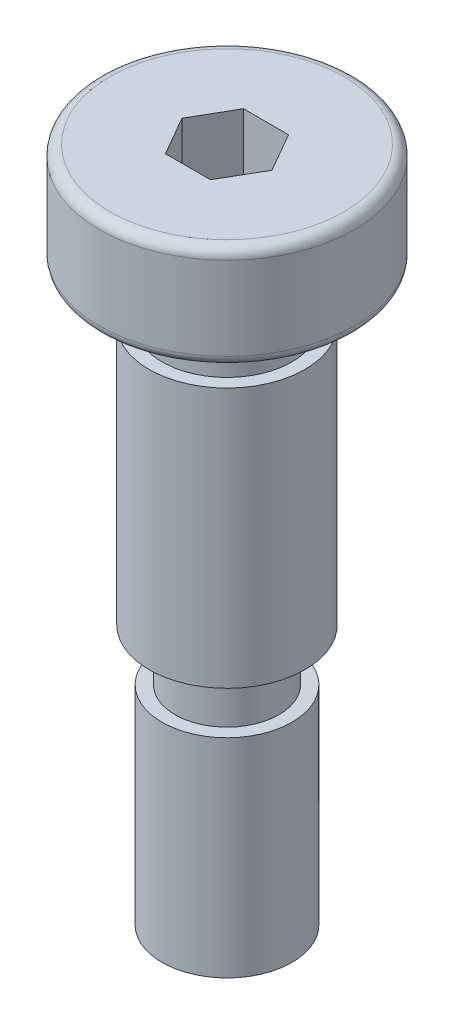
ISO-10303-21;
HEADER;
FILE_DESCRIPTION(('STEP AP214'),'2;1');
FILE_NAME('part.step','',(''),(''),'','','');
FILE_SCHEMA(('AUTOMOTIVE_DESIGN { 1 0 10303 214 1 1 1 1 }'));
ENDSEC;
DATA;
#1=APPLICATION_CONTEXT('core data for automotive mechanical design processes');
#2=APPLICATION_PROTOCOL_DEFINITION('international standard','automotive_design',2000,#1);
#3=PRODUCT_CONTEXT('',#1,'mechanical');
#4=PRODUCT('Part','Part','',(#3));
#5=PRODUCT_RELATED_PRODUCT_CATEGORY('part','',(#4));
#6=PRODUCT_DEFINITION_FORMATION('','',#4);
#7=PRODUCT_DEFINITION_CONTEXT('part definition',#1,'design');
#8=PRODUCT_DEFINITION('design','',#6,#7);
#9=PRODUCT_DEFINITION_SHAPE('','',#8);
#10=(LENGTH_UNIT() NAMED_UNIT(*) SI_UNIT(.MILLI.,.METRE.));
#11=(NAMED_UNIT(*) PLANE_ANGLE_UNIT() SI_UNIT($,.RADIAN.));
#12=(NAMED_UNIT(*) SI_UNIT($,.STERADIAN.) SOLID_ANGLE_UNIT());
#13=UNCERTAINTY_MEASURE_WITH_UNIT(LENGTH_MEASURE(1.E-05),#10,'distance_accuracy_value','');
#14=(GEOMETRIC_REPRESENTATION_CONTEXT(3) GLOBAL_UNCERTAINTY_ASSIGNED_CONTEXT((#13)) GLOBAL_UNIT_ASSIGNED_CONTEXT((#10,
#11,#12)) REPRESENTATION_CONTEXT('',''));
#15=CARTESIAN_POINT('',(0.,0.,0.));
#16=DIRECTION('',(0.,0.,1.));
#17=DIRECTION('',(1.,0.,0.));
#18=AXIS2_PLACEMENT_3D('',#15,#16,#17);
#19=CARTESIAN_POINT('',(0.,26.,0.));
#20=DIRECTION('',(0.,-1.,0.));
#21=DIRECTION('',(0.,0.,-1.));
#22=AXIS2_PLACEMENT_3D('',#19,#20,#21);
#23=PLANE('',#22);
#24=DIRECTION('',(-1.,0.,0.));
#25=VECTOR('',#24,1.);
#26=CARTESIAN_POINT('',(0.866025403784438,26.,-1.5));
#27=LINE('',#26,#25);
#28=CARTESIAN_POINT('',(0.866025403784438,26.,-1.5));
#29=VERTEX_POINT('',#28);
#30=CARTESIAN_POINT('',(-0.866025403784439,26.,-1.5));
#31=VERTEX_POINT('',#30);
#32=EDGE_CURVE('E124',#29,#31,#27,.T.);
#33=ORIENTED_EDGE('',*,*,#32,.F.);
#34=DIRECTION('',(-0.5,0.,-0.866025403784438));
#35=VECTOR('',#34,1.);
#36=CARTESIAN_POINT('',(1.73205080756888,26.,0.));
#37=LINE('',#36,#35);
#38=CARTESIAN_POINT('',(1.73205080756888,26.,0.));
#39=VERTEX_POINT('',#38);
#40=EDGE_CURVE('E50',#39,#29,#37,.T.);
#41=ORIENTED_EDGE('',*,*,#40,.F.);
#42=DIRECTION('',(0.5,0.,-0.866025403784438));
#43=VECTOR('',#42,1.);
#44=CARTESIAN_POINT('',(0.866025403784438,26.,1.5));
#45=LINE('',#44,#43);
#46=CARTESIAN_POINT('',(0.866025403784438,26.,1.5));
#47=VERTEX_POINT('',#46);
#48=EDGE_CURVE('E133',#47,#39,#45,.T.);
#49=ORIENTED_EDGE('',*,*,#48,.F.);
#50=DIRECTION('',(1.,0.,0.));
#51=VECTOR('',#50,1.);
#52=CARTESIAN_POINT('',(-0.866025403784439,26.,1.5));
#53=LINE('',#52,#51);
#54=CARTESIAN_POINT('',(-0.866025403784439,26.,1.5));
#55=VERTEX_POINT('',#54);
#56=EDGE_CURVE('E131',#55,#47,#53,.T.);
#57=ORIENTED_EDGE('',*,*,#56,.F.);
#58=DIRECTION('',(0.5,0.,0.866025403784439));
#59=VECTOR('',#58,1.);
#60=CARTESIAN_POINT('',(-1.73205080756888,26.,0.));
#61=LINE('',#60,#59);
#62=CARTESIAN_POINT('',(-1.73205080756888,26.,0.));
#63=VERTEX_POINT('',#62);
#64=EDGE_CURVE('E98',#63,#55,#61,.T.);
#65=ORIENTED_EDGE('',*,*,#64,.F.);
#66=DIRECTION('',(-0.5,0.,0.866025403784439));
#67=VECTOR('',#66,1.);
#68=CARTESIAN_POINT('',(-0.866025403784439,26.,-1.5));
#69=LINE('',#68,#67);
#70=EDGE_CURVE('E127',#31,#63,#69,.T.);
#71=ORIENTED_EDGE('',*,*,#70,.F.);
#72=EDGE_LOOP('',(#33,#41,#49,#57,#65,#71));
#73=FACE_BOUND('',#72,.T.);
#74=CARTESIAN_POINT('',(0.,26.,0.));
#75=DIRECTION('',(0.,-1.,0.));
#76=DIRECTION('',(0.,0.,-1.));
#77=AXIS2_PLACEMENT_3D('',#74,#75,#76);
#78=CIRCLE('',#77,4.5);
#79=CARTESIAN_POINT('',(0.,26.,-4.5));
#80=VERTEX_POINT('',#79);
#81=EDGE_CURVE('E11',#80,#80,#78,.T.);
#82=ORIENTED_EDGE('',*,*,#81,.F.);
#83=EDGE_LOOP('',(#82));
#84=FACE_BOUND('',#83,.T.);
#85=ADVANCED_FACE('F36',(#73,#84),#23,.F.);
#86=CARTESIAN_POINT('',(0.,25.6,0.));
#87=DIRECTION('',(0.,-1.,0.));
#88=DIRECTION('',(0.,0.,-1.));
#89=AXIS2_PLACEMENT_3D('',#86,#87,#88);
#90=TOROIDAL_SURFACE('',#89,4.5,0.399999999999998);
#91=CARTESIAN_POINT('',(0.,25.6,0.));
#92=DIRECTION('',(0.,-1.,0.));
#93=DIRECTION('',(0.,0.,-1.));
#94=AXIS2_PLACEMENT_3D('',#91,#92,#93);
#95=CIRCLE('',#94,4.9);
#96=CARTESIAN_POINT('',(0.,25.6,-4.9));
#97=VERTEX_POINT('',#96);
#98=EDGE_CURVE('E43',#97,#97,#95,.T.);
#99=ORIENTED_EDGE('',*,*,#98,.F.);
#100=EDGE_LOOP('',(#99));
#101=FACE_BOUND('',#100,.T.);
#102=ORIENTED_EDGE('',*,*,#81,.T.);
#103=EDGE_LOOP('',(#102));
#104=FACE_BOUND('',#103,.T.);
#105=ADVANCED_FACE('F176',(#101,#104),#90,.T.);
#106=CARTESIAN_POINT('',(0.,0.,0.));
#107=DIRECTION('',(0.,-1.,0.));
#108=DIRECTION('',(0.,0.,-1.));
#109=AXIS2_PLACEMENT_3D('',#106,#107,#108);
#110=CYLINDRICAL_SURFACE('',#109,4.9);
#111=CARTESIAN_POINT('',(0.,22.4,0.));
#112=DIRECTION('',(0.,-1.,0.));
#113=DIRECTION('',(0.,0.,-1.));
#114=AXIS2_PLACEMENT_3D('',#111,#112,#113);
#115=CIRCLE('',#114,4.9);
#116=CARTESIAN_POINT('',(0.,22.4,-4.9));
#117=VERTEX_POINT('',#116);
#118=EDGE_CURVE('E169',#117,#117,#115,.T.);
#119=ORIENTED_EDGE('',*,*,#118,.F.);
#120=EDGE_LOOP('',(#119));
#121=FACE_BOUND('',#120,.T.);
#122=ORIENTED_EDGE('',*,*,#98,.T.);
#123=EDGE_LOOP('',(#122));
#124=FACE_BOUND('',#123,.T.);
#125=ADVANCED_FACE('F174',(#121,#124),#110,.T.);
#126=CARTESIAN_POINT('',(0.,22.4,0.));
#127=DIRECTION('',(0.,-1.,0.));
#128=DIRECTION('',(0.,0.,-1.));
#129=AXIS2_PLACEMENT_3D('',#126,#127,#128);
#130=TOROIDAL_SURFACE('',#129,4.5,0.400000000000002);
#131=CARTESIAN_POINT('',(0.,22.,0.));
#132=DIRECTION('',(0.,-1.,0.));
#133=DIRECTION('',(0.,0.,-1.));
#134=AXIS2_PLACEMENT_3D('',#131,#132,#133);
#135=CIRCLE('',#134,4.5);
#136=CARTESIAN_POINT('',(0.,22.,-4.5));
#137=VERTEX_POINT('',#136);
#138=EDGE_CURVE('E166',#137,#137,#135,.T.);
#139=ORIENTED_EDGE('',*,*,#138,.F.);
#140=EDGE_LOOP('',(#139));
#141=FACE_BOUND('',#140,.T.);
#142=ORIENTED_EDGE('',*,*,#118,.T.);
#143=EDGE_LOOP('',(#142));
#144=FACE_BOUND('',#143,.T.);
#145=ADVANCED_FACE('F237',(#141,#144),#130,.T.);
#146=CARTESIAN_POINT('',(-4.5,22.,0.));
#147=DIRECTION('',(0.,1.,0.));
#148=DIRECTION('',(0.,0.,1.));
#149=AXIS2_PLACEMENT_3D('',#146,#147,#148);
#150=PLANE('',#149);
#151=CARTESIAN_POINT('',(0.,22.,0.));
#152=DIRECTION('',(0.,-1.,0.));
#153=DIRECTION('',(0.,0.,-1.));
#154=AXIS2_PLACEMENT_3D('',#151,#152,#153);
#155=CIRCLE('',#154,2.5);
#156=CARTESIAN_POINT('',(0.,22.,-2.5));
#157=VERTEX_POINT('',#156);
#158=EDGE_CURVE('E163',#157,#157,#155,.T.);
#159=ORIENTED_EDGE('',*,*,#158,.F.);
#160=EDGE_LOOP('',(#159));
#161=FACE_BOUND('',#160,.T.);
#162=ORIENTED_EDGE('',*,*,#138,.T.);
#163=EDGE_LOOP('',(#162));
#164=FACE_BOUND('',#163,.T.);
#165=ADVANCED_FACE('F233',(#161,#164),#150,.F.);
#166=CARTESIAN_POINT('',(0.,0.,0.));
#167=DIRECTION('',(0.,-1.,0.));
#168=DIRECTION('',(0.,0.,-1.));
#169=AXIS2_PLACEMENT_3D('',#166,#167,#168);
#170=CYLINDRICAL_SURFACE('',#169,2.5);
#171=CARTESIAN_POINT('',(0.,20.,0.));
#172=DIRECTION('',(0.,-1.,0.));
#173=DIRECTION('',(0.,0.,-1.));
#174=AXIS2_PLACEMENT_3D('',#171,#172,#173);
#175=CIRCLE('',#174,2.5);
#176=CARTESIAN_POINT('',(0.,20.,-2.5));
#177=VERTEX_POINT('',#176);
#178=EDGE_CURVE('E160',#177,#177,#175,.T.);
#179=ORIENTED_EDGE('',*,*,#178,.F.);
#180=EDGE_LOOP('',(#179));
#181=FACE_BOUND('',#180,.T.);
#182=ORIENTED_EDGE('',*,*,#158,.T.);
#183=EDGE_LOOP('',(#182));
#184=FACE_BOUND('',#183,.T.);
#185=ADVANCED_FACE('F229',(#181,#184),#170,.T.);
#186=CARTESIAN_POINT('',(-2.5,20.,0.));
#187=DIRECTION('',(0.,-1.,0.));
#188=DIRECTION('',(0.,0.,-1.));
#189=AXIS2_PLACEMENT_3D('',#186,#187,#188);
#190=PLANE('',#189);
#191=CARTESIAN_POINT('',(0.,20.,0.));
#192=DIRECTION('',(0.,-1.,0.));
#193=DIRECTION('',(0.,0.,-1.));
#194=AXIS2_PLACEMENT_3D('',#191,#192,#193);
#195=CIRCLE('',#194,3.);
#196=CARTESIAN_POINT('',(0.,20.,-3.));
#197=VERTEX_POINT('',#196);
#198=EDGE_CURVE('E157',#197,#197,#195,.T.);
#199=ORIENTED_EDGE('',*,*,#198,.F.);
#200=EDGE_LOOP('',(#199));
#201=FACE_BOUND('',#200,.T.);
#202=ORIENTED_EDGE('',*,*,#178,.T.);
#203=EDGE_LOOP('',(#202));
#204=FACE_BOUND('',#203,.T.);
#205=ADVANCED_FACE('F225',(#201,#204),#190,.F.);
#206=CARTESIAN_POINT('',(0.,0.,0.));
#207=DIRECTION('',(0.,-1.,0.));
#208=DIRECTION('',(0.,0.,-1.));
#209=AXIS2_PLACEMENT_3D('',#206,#207,#208);
#210=CYLINDRICAL_SURFACE('',#209,3.);
#211=CARTESIAN_POINT('',(0.,10.,0.));
#212=DIRECTION('',(0.,-1.,0.));
#213=DIRECTION('',(0.,0.,-1.));
#214=AXIS2_PLACEMENT_3D('',#211,#212,#213);
#215=CIRCLE('',#214,3.);
#216=CARTESIAN_POINT('',(0.,10.,-3.));
#217=VERTEX_POINT('',#216);
#218=EDGE_CURVE('E154',#217,#217,#215,.T.);
#219=ORIENTED_EDGE('',*,*,#218,.F.);
#220=EDGE_LOOP('',(#219));
#221=FACE_BOUND('',#220,.T.);
#222=ORIENTED_EDGE('',*,*,#198,.T.);
#223=EDGE_LOOP('',(#222));
#224=FACE_BOUND('',#223,.T.);
#225=ADVANCED_FACE('F221',(#221,#224),#210,.T.);
#226=CARTESIAN_POINT('',(-3.,10.,0.));
#227=DIRECTION('',(0.,1.,0.));
#228=DIRECTION('',(0.,0.,1.));
#229=AXIS2_PLACEMENT_3D('',#226,#227,#228);
#230=PLANE('',#229);
#231=CARTESIAN_POINT('',(0.,10.,0.));
#232=DIRECTION('',(0.,-1.,0.));
#233=DIRECTION('',(0.,0.,-1.));
#234=AXIS2_PLACEMENT_3D('',#231,#232,#233);
#235=CIRCLE('',#234,2.);
#236=CARTESIAN_POINT('',(0.,10.,-2.));
#237=VERTEX_POINT('',#236);
#238=EDGE_CURVE('E151',#237,#237,#235,.T.);
#239=ORIENTED_EDGE('',*,*,#238,.F.);
#240=EDGE_LOOP('',(#239));
#241=FACE_BOUND('',#240,.T.);
#242=ORIENTED_EDGE('',*,*,#218,.T.);
#243=EDGE_LOOP('',(#242));
#244=FACE_BOUND('',#243,.T.);
#245=ADVANCED_FACE('F217',(#241,#244),#230,.F.);
#246=CARTESIAN_POINT('',(0.,0.,0.));
#247=DIRECTION('',(0.,-1.,0.));
#248=DIRECTION('',(0.,0.,-1.));
#249=AXIS2_PLACEMENT_3D('',#246,#247,#248);
#250=CYLINDRICAL_SURFACE('',#249,2.);
#251=CARTESIAN_POINT('',(0.,8.,0.));
#252=DIRECTION('',(0.,-1.,0.));
#253=DIRECTION('',(0.,0.,-1.));
#254=AXIS2_PLACEMENT_3D('',#251,#252,#253);
#255=CIRCLE('',#254,2.);
#256=CARTESIAN_POINT('',(0.,8.,-2.));
#257=VERTEX_POINT('',#256);
#258=EDGE_CURVE('E148',#257,#257,#255,.T.);
#259=ORIENTED_EDGE('',*,*,#258,.F.);
#260=EDGE_LOOP('',(#259));
#261=FACE_BOUND('',#260,.T.);
#262=ORIENTED_EDGE('',*,*,#238,.T.);
#263=EDGE_LOOP('',(#262));
#264=FACE_BOUND('',#263,.T.);
#265=ADVANCED_FACE('F213',(#261,#264),#250,.T.);
#266=CARTESIAN_POINT('',(-2.,8.,0.));
#267=DIRECTION('',(0.,-1.,0.));
#268=DIRECTION('',(0.,0.,-1.));
#269=AXIS2_PLACEMENT_3D('',#266,#267,#268);
#270=PLANE('',#269);
#271=CARTESIAN_POINT('',(0.,8.,0.));
#272=DIRECTION('',(0.,-1.,0.));
#273=DIRECTION('',(0.,0.,-1.));
#274=AXIS2_PLACEMENT_3D('',#271,#272,#273);
#275=CIRCLE('',#274,2.5);
#276=CARTESIAN_POINT('',(0.,8.,-2.5));
#277=VERTEX_POINT('',#276);
#278=EDGE_CURVE('E145',#277,#277,#275,.T.);
#279=ORIENTED_EDGE('',*,*,#278,.F.);
#280=EDGE_LOOP('',(#279));
#281=FACE_BOUND('',#280,.T.);
#282=ORIENTED_EDGE('',*,*,#258,.T.);
#283=EDGE_LOOP('',(#282));
#284=FACE_BOUND('',#283,.T.);
#285=ADVANCED_FACE('F209',(#281,#284),#270,.F.);
#286=CARTESIAN_POINT('',(0.,0.,0.));
#287=DIRECTION('',(0.,-1.,0.));
#288=DIRECTION('',(0.,0.,-1.));
#289=AXIS2_PLACEMENT_3D('',#286,#287,#288);
#290=CYLINDRICAL_SURFACE('',#289,2.5);
#291=CARTESIAN_POINT('',(0.,0.,0.));
#292=DIRECTION('',(0.,-1.,0.));
#293=DIRECTION('',(0.,0.,-1.));
#294=AXIS2_PLACEMENT_3D('',#291,#292,#293);
#295=CIRCLE('',#294,2.5);
#296=CARTESIAN_POINT('',(0.,0.,-2.5));
#297=VERTEX_POINT('',#296);
#298=EDGE_CURVE('E137',#297,#297,#295,.T.);
#299=ORIENTED_EDGE('',*,*,#298,.F.);
#300=EDGE_LOOP('',(#299));
#301=FACE_BOUND('',#300,.T.);
#302=ORIENTED_EDGE('',*,*,#278,.T.);
#303=EDGE_LOOP('',(#302));
#304=FACE_BOUND('',#303,.T.);
#305=ADVANCED_FACE('F201',(#301,#304),#290,.T.);
#306=CARTESIAN_POINT('',(-2.5,0.,0.));
#307=DIRECTION('',(0.,1.,0.));
#308=DIRECTION('',(0.,0.,1.));
#309=AXIS2_PLACEMENT_3D('',#306,#307,#308);
#310=PLANE('',#309);
#311=ORIENTED_EDGE('',*,*,#298,.T.);
#312=EDGE_LOOP('',(#311));
#313=FACE_BOUND('',#312,.T.);
#314=ADVANCED_FACE('F194',(#313),#310,.F.);
#315=CARTESIAN_POINT('',(1.73205080756888,22.5,0.));
#316=DIRECTION('',(0.866025403784438,0.,-0.5));
#317=DIRECTION('',(-0.5,0.,-0.866025403784439));
#318=AXIS2_PLACEMENT_3D('',#315,#316,#317);
#319=PLANE('',#318);
#320=ORIENTED_EDGE('',*,*,#40,.T.);
#321=DIRECTION('',(0.,1.,0.));
#322=VECTOR('',#321,1.);
#323=CARTESIAN_POINT('',(0.866025403784438,22.5,-1.5));
#324=LINE('',#323,#322);
#325=CARTESIAN_POINT('',(0.866025403784438,22.5,-1.5));
#326=VERTEX_POINT('',#325);
#327=EDGE_CURVE('E80',#326,#29,#324,.T.);
#328=ORIENTED_EDGE('',*,*,#327,.F.);
#329=DIRECTION('',(-0.5,0.,-0.866025403784438));
#330=VECTOR('',#329,1.);
#331=CARTESIAN_POINT('',(1.73205080756888,22.5,0.));
#332=LINE('',#331,#330);
#333=CARTESIAN_POINT('',(1.73205080756888,22.5,0.));
#334=VERTEX_POINT('',#333);
#335=EDGE_CURVE('E135',#334,#326,#332,.T.);
#336=ORIENTED_EDGE('',*,*,#335,.F.);
#337=DIRECTION('',(0.,1.,0.));
#338=VECTOR('',#337,1.);
#339=CARTESIAN_POINT('',(1.73205080756888,22.5,0.));
#340=LINE('',#339,#338);
#341=EDGE_CURVE('E58',#334,#39,#340,.T.);
#342=ORIENTED_EDGE('',*,*,#341,.T.);
#343=EDGE_LOOP('',(#320,#328,#336,#342));
#344=FACE_BOUND('',#343,.T.);
#345=ADVANCED_FACE('F191',(#344),#319,.F.);
#346=CARTESIAN_POINT('',(0.866025403784438,22.5,1.5));
#347=DIRECTION('',(0.866025403784438,0.,0.5));
#348=DIRECTION('',(0.5,0.,-0.866025403784439));
#349=AXIS2_PLACEMENT_3D('',#346,#347,#348);
#350=PLANE('',#349);
#351=ORIENTED_EDGE('',*,*,#48,.T.);
#352=ORIENTED_EDGE('',*,*,#341,.F.);
#353=DIRECTION('',(0.5,0.,-0.866025403784438));
#354=VECTOR('',#353,1.);
#355=CARTESIAN_POINT('',(0.866025403784438,22.5,1.5));
#356=LINE('',#355,#354);
#357=CARTESIAN_POINT('',(0.866025403784438,22.5,1.5));
#358=VERTEX_POINT('',#357);
#359=EDGE_CURVE('E110',#358,#334,#356,.T.);
#360=ORIENTED_EDGE('',*,*,#359,.F.);
#361=DIRECTION('',(0.,1.,0.));
#362=VECTOR('',#361,1.);
#363=CARTESIAN_POINT('',(0.866025403784438,22.5,1.5));
#364=LINE('',#363,#362);
#365=EDGE_CURVE('E102',#358,#47,#364,.T.);
#366=ORIENTED_EDGE('',*,*,#365,.T.);
#367=EDGE_LOOP('',(#351,#352,#360,#366));
#368=FACE_BOUND('',#367,.T.);
#369=ADVANCED_FACE('F193',(#368),#350,.F.);
#370=CARTESIAN_POINT('',(-0.866025403784439,22.5,1.5));
#371=DIRECTION('',(0.,0.,1.));
#372=DIRECTION('',(1.,0.,0.));
#373=AXIS2_PLACEMENT_3D('',#370,#371,#372);
#374=PLANE('',#373);
#375=ORIENTED_EDGE('',*,*,#56,.T.);
#376=ORIENTED_EDGE('',*,*,#365,.F.);
#377=DIRECTION('',(1.,0.,0.));
#378=VECTOR('',#377,1.);
#379=CARTESIAN_POINT('',(-0.866025403784439,22.5,1.5));
#380=LINE('',#379,#378);
#381=CARTESIAN_POINT('',(-0.866025403784439,22.5,1.5));
#382=VERTEX_POINT('',#381);
#383=EDGE_CURVE('E106',#382,#358,#380,.T.);
#384=ORIENTED_EDGE('',*,*,#383,.F.);
#385=DIRECTION('',(0.,1.,0.));
#386=VECTOR('',#385,1.);
#387=CARTESIAN_POINT('',(-0.866025403784439,22.5,1.5));
#388=LINE('',#387,#386);
#389=EDGE_CURVE('E91',#382,#55,#388,.T.);
#390=ORIENTED_EDGE('',*,*,#389,.T.);
#391=EDGE_LOOP('',(#375,#376,#384,#390));
#392=FACE_BOUND('',#391,.T.);
#393=ADVANCED_FACE('F107',(#392),#374,.F.);
#394=CARTESIAN_POINT('',(-1.73205080756888,22.5,0.));
#395=DIRECTION('',(-0.866025403784439,0.,0.5));
#396=DIRECTION('',(0.5,0.,0.866025403784439));
#397=AXIS2_PLACEMENT_3D('',#394,#395,#396);
#398=PLANE('',#397);
#399=ORIENTED_EDGE('',*,*,#64,.T.);
#400=ORIENTED_EDGE('',*,*,#389,.F.);
#401=DIRECTION('',(0.5,0.,0.866025403784439));
#402=VECTOR('',#401,1.);
#403=CARTESIAN_POINT('',(-1.73205080756888,22.5,0.));
#404=LINE('',#403,#402);
#405=CARTESIAN_POINT('',(-1.73205080756888,22.5,0.));
#406=VERTEX_POINT('',#405);
#407=EDGE_CURVE('E95',#406,#382,#404,.T.);
#408=ORIENTED_EDGE('',*,*,#407,.F.);
#409=DIRECTION('',(0.,1.,0.));
#410=VECTOR('',#409,1.);
#411=CARTESIAN_POINT('',(-1.73205080756888,22.5,0.));
#412=LINE('',#411,#410);
#413=EDGE_CURVE('E103',#406,#63,#412,.T.);
#414=ORIENTED_EDGE('',*,*,#413,.T.);
#415=EDGE_LOOP('',(#399,#400,#408,#414));
#416=FACE_BOUND('',#415,.T.);
#417=ADVANCED_FACE('F93',(#416),#398,.F.);
#418=CARTESIAN_POINT('',(-0.866025403784439,22.5,-1.5));
#419=DIRECTION('',(-0.866025403784439,0.,-0.5));
#420=DIRECTION('',(-0.5,0.,0.866025403784439));
#421=AXIS2_PLACEMENT_3D('',#418,#419,#420);
#422=PLANE('',#421);
#423=ORIENTED_EDGE('',*,*,#70,.T.);
#424=ORIENTED_EDGE('',*,*,#413,.F.);
#425=DIRECTION('',(-0.5,0.,0.866025403784439));
#426=VECTOR('',#425,1.);
#427=CARTESIAN_POINT('',(-0.866025403784439,22.5,-1.5));
#428=LINE('',#427,#426);
#429=CARTESIAN_POINT('',(-0.866025403784439,22.5,-1.5));
#430=VERTEX_POINT('',#429);
#431=EDGE_CURVE('E116',#430,#406,#428,.T.);
#432=ORIENTED_EDGE('',*,*,#431,.F.);
#433=DIRECTION('',(0.,1.,0.));
#434=VECTOR('',#433,1.);
#435=CARTESIAN_POINT('',(-0.866025403784439,22.5,-1.5));
#436=LINE('',#435,#434);
#437=EDGE_CURVE('E140',#430,#31,#436,.T.);
#438=ORIENTED_EDGE('',*,*,#437,.T.);
#439=EDGE_LOOP('',(#423,#424,#432,#438));
#440=FACE_BOUND('',#439,.T.);
#441=ADVANCED_FACE('F324',(#440),#422,.F.);
#442=CARTESIAN_POINT('',(0.866025403784438,22.5,-1.5));
#443=DIRECTION('',(0.,0.,-1.));
#444=DIRECTION('',(-1.,0.,0.));
#445=AXIS2_PLACEMENT_3D('',#442,#443,#444);
#446=PLANE('',#445);
#447=ORIENTED_EDGE('',*,*,#32,.T.);
#448=ORIENTED_EDGE('',*,*,#437,.F.);
#449=DIRECTION('',(-1.,0.,0.));
#450=VECTOR('',#449,1.);
#451=CARTESIAN_POINT('',(0.866025403784438,22.5,-1.5));
#452=LINE('',#451,#450);
#453=EDGE_CURVE('E118',#326,#430,#452,.T.);
#454=ORIENTED_EDGE('',*,*,#453,.F.);
#455=ORIENTED_EDGE('',*,*,#327,.T.);
#456=EDGE_LOOP('',(#447,#448,#454,#455));
#457=FACE_BOUND('',#456,.T.);
#458=ADVANCED_FACE('F189',(#457),#446,.F.);
#459=CARTESIAN_POINT('',(0.,22.5,0.));
#460=DIRECTION('',(0.,1.,0.));
#461=DIRECTION('',(0.,0.,1.));
#462=AXIS2_PLACEMENT_3D('',#459,#460,#461);
#463=PLANE('',#462);
#464=ORIENTED_EDGE('',*,*,#335,.T.);
#465=ORIENTED_EDGE('',*,*,#453,.T.);
#466=ORIENTED_EDGE('',*,*,#431,.T.);
#467=ORIENTED_EDGE('',*,*,#407,.T.);
#468=ORIENTED_EDGE('',*,*,#383,.T.);
#469=ORIENTED_EDGE('',*,*,#359,.T.);
#470=EDGE_LOOP('',(#464,#465,#466,#467,#468,#469));
#471=FACE_BOUND('',#470,.T.);
#472=ADVANCED_FACE('F113',(#471),#463,.T.);
#473=CLOSED_SHELL('',(#85,#105,#125,#145,#165,#185,#205,#225,#245,#265,#285,#305,#314,#345,#369,
#393,#417,#441,#458,#472));
#474=MANIFOLD_SOLID_BREP('B2',#473);
#475=ADVANCED_BREP_SHAPE_REPRESENTATION('',(#18,#474),#14);
#476=SHAPE_DEFINITION_REPRESENTATION(#9,#475);
ENDSEC;
END-ISO-10303-21;
